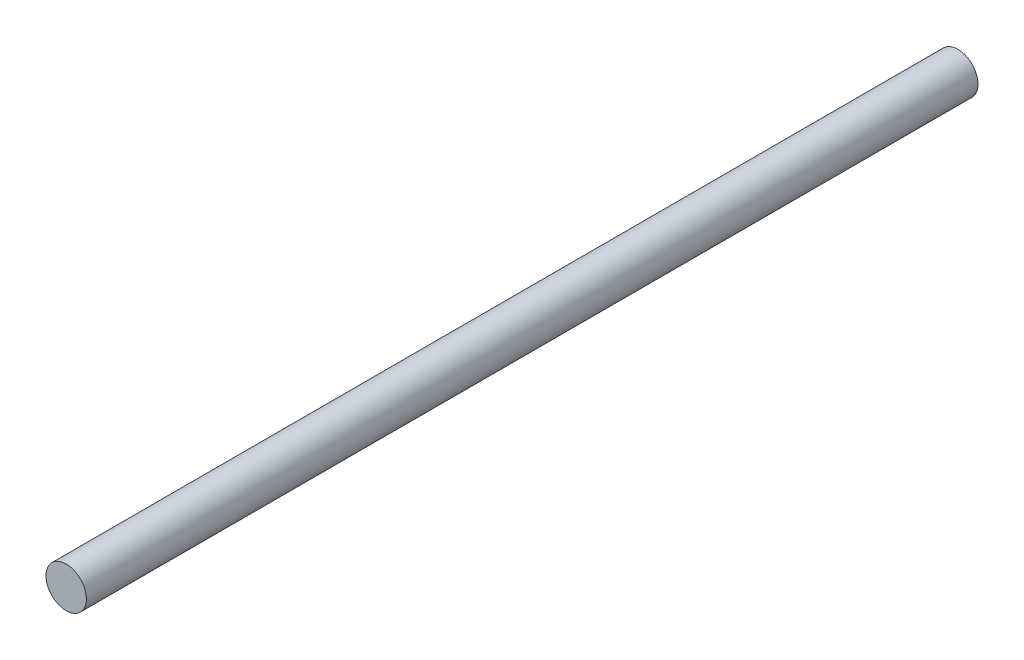
ISO-10303-21;
HEADER;
FILE_DESCRIPTION(('STEP AP214'),'2;1');
FILE_NAME('part.step','',(''),(''),'','','');
FILE_SCHEMA(('AUTOMOTIVE_DESIGN { 1 0 10303 214 1 1 1 1 }'));
ENDSEC;
DATA;
#1=APPLICATION_CONTEXT('core data for automotive mechanical design processes');
#2=APPLICATION_PROTOCOL_DEFINITION('international standard','automotive_design',2000,#1);
#3=PRODUCT_CONTEXT('',#1,'mechanical');
#4=PRODUCT('Part','Part','',(#3));
#5=PRODUCT_RELATED_PRODUCT_CATEGORY('part','',(#4));
#6=PRODUCT_DEFINITION_FORMATION('','',#4);
#7=PRODUCT_DEFINITION_CONTEXT('part definition',#1,'design');
#8=PRODUCT_DEFINITION('design','',#6,#7);
#9=PRODUCT_DEFINITION_SHAPE('','',#8);
#10=(LENGTH_UNIT() NAMED_UNIT(*) SI_UNIT(.MILLI.,.METRE.));
#11=(NAMED_UNIT(*) PLANE_ANGLE_UNIT() SI_UNIT($,.RADIAN.));
#12=(NAMED_UNIT(*) SI_UNIT($,.STERADIAN.) SOLID_ANGLE_UNIT());
#13=UNCERTAINTY_MEASURE_WITH_UNIT(LENGTH_MEASURE(1.E-05),#10,'distance_accuracy_value','');
#14=(GEOMETRIC_REPRESENTATION_CONTEXT(3) GLOBAL_UNCERTAINTY_ASSIGNED_CONTEXT((#13)) GLOBAL_UNIT_ASSIGNED_CONTEXT((#10,
#11,#12)) REPRESENTATION_CONTEXT('',''));
#15=CARTESIAN_POINT('',(0.,0.,0.));
#16=DIRECTION('',(0.,0.,1.));
#17=DIRECTION('',(1.,0.,0.));
#18=AXIS2_PLACEMENT_3D('',#15,#16,#17);
#19=CARTESIAN_POINT('',(0.,0.,95.25));
#20=DIRECTION('',(0.,0.,-1.));
#21=DIRECTION('',(-1.,0.,0.));
#22=AXIS2_PLACEMENT_3D('',#19,#20,#21);
#23=CYLINDRICAL_SURFACE('',#22,2.159);
#24=CARTESIAN_POINT('',(0.,0.,95.25));
#25=DIRECTION('',(0.,0.,1.));
#26=DIRECTION('',(1.,0.,0.));
#27=AXIS2_PLACEMENT_3D('',#24,#25,#26);
#28=CIRCLE('',#27,2.159);
#29=CARTESIAN_POINT('',(2.159,0.,95.25));
#30=VERTEX_POINT('',#29);
#31=EDGE_CURVE('E10',#30,#30,#28,.T.);
#32=ORIENTED_EDGE('',*,*,#31,.F.);
#33=EDGE_LOOP('',(#32));
#34=FACE_BOUND('',#33,.T.);
#35=CARTESIAN_POINT('',(0.,0.,0.));
#36=DIRECTION('',(0.,0.,1.));
#37=DIRECTION('',(1.,0.,0.));
#38=AXIS2_PLACEMENT_3D('',#35,#36,#37);
#39=CIRCLE('',#38,2.159);
#40=CARTESIAN_POINT('',(2.159,0.,0.));
#41=VERTEX_POINT('',#40);
#42=EDGE_CURVE('E40',#41,#41,#39,.T.);
#43=ORIENTED_EDGE('',*,*,#42,.T.);
#44=EDGE_LOOP('',(#43));
#45=FACE_BOUND('',#44,.T.);
#46=ADVANCED_FACE('F37',(#34,#45),#23,.T.);
#47=CARTESIAN_POINT('',(0.,0.,95.25));
#48=DIRECTION('',(0.,0.,1.));
#49=DIRECTION('',(1.,0.,0.));
#50=AXIS2_PLACEMENT_3D('',#47,#48,#49);
#51=PLANE('',#50);
#52=ORIENTED_EDGE('',*,*,#31,.T.);
#53=EDGE_LOOP('',(#52));
#54=FACE_BOUND('',#53,.T.);
#55=ADVANCED_FACE('F54',(#54),#51,.T.);
#56=CARTESIAN_POINT('',(0.,0.,0.));
#57=DIRECTION('',(0.,0.,1.));
#58=DIRECTION('',(1.,0.,0.));
#59=AXIS2_PLACEMENT_3D('',#56,#57,#58);
#60=PLANE('',#59);
#61=ORIENTED_EDGE('',*,*,#42,.F.);
#62=EDGE_LOOP('',(#61));
#63=FACE_BOUND('',#62,.T.);
#64=ADVANCED_FACE('F52',(#63),#60,.F.);
#65=CLOSED_SHELL('',(#46,#55,#64));
#66=MANIFOLD_SOLID_BREP('B2',#65);
#67=ADVANCED_BREP_SHAPE_REPRESENTATION('',(#18,#66),#14);
#68=SHAPE_DEFINITION_REPRESENTATION(#9,#67);
ENDSEC;
END-ISO-10303-21;
